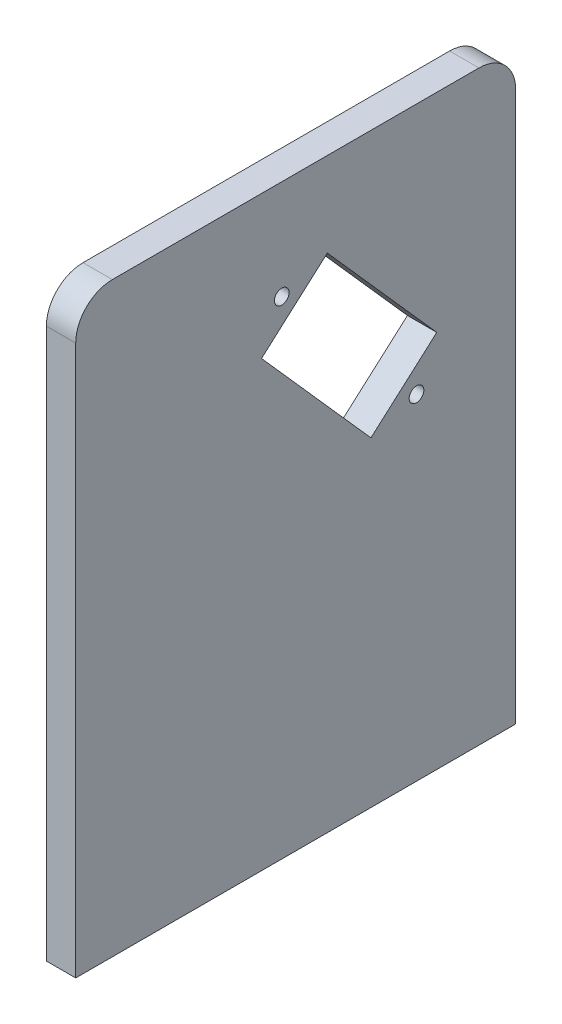
ISO-10303-21;
HEADER;
FILE_DESCRIPTION(('STEP AP214'),'2;1');
FILE_NAME('part.step','',(''),(''),'','','');
FILE_SCHEMA(('AUTOMOTIVE_DESIGN { 1 0 10303 214 1 1 1 1 }'));
ENDSEC;
DATA;
#1=APPLICATION_CONTEXT('core data for automotive mechanical design processes');
#2=APPLICATION_PROTOCOL_DEFINITION('international standard','automotive_design',2000,#1);
#3=PRODUCT_CONTEXT('',#1,'mechanical');
#4=PRODUCT('Part','Part','',(#3));
#5=PRODUCT_RELATED_PRODUCT_CATEGORY('part','',(#4));
#6=PRODUCT_DEFINITION_FORMATION('','',#4);
#7=PRODUCT_DEFINITION_CONTEXT('part definition',#1,'design');
#8=PRODUCT_DEFINITION('design','',#6,#7);
#9=PRODUCT_DEFINITION_SHAPE('','',#8);
#10=(LENGTH_UNIT() NAMED_UNIT(*) SI_UNIT(.MILLI.,.METRE.));
#11=(NAMED_UNIT(*) PLANE_ANGLE_UNIT() SI_UNIT($,.RADIAN.));
#12=(NAMED_UNIT(*) SI_UNIT($,.STERADIAN.) SOLID_ANGLE_UNIT());
#13=UNCERTAINTY_MEASURE_WITH_UNIT(LENGTH_MEASURE(1.E-05),#10,'distance_accuracy_value','');
#14=(GEOMETRIC_REPRESENTATION_CONTEXT(3) GLOBAL_UNCERTAINTY_ASSIGNED_CONTEXT((#13)) GLOBAL_UNIT_ASSIGNED_CONTEXT((#10,
#11,#12)) REPRESENTATION_CONTEXT('',''));
#15=CARTESIAN_POINT('',(0.,0.,0.));
#16=DIRECTION('',(0.,0.,1.));
#17=DIRECTION('',(1.,0.,0.));
#18=AXIS2_PLACEMENT_3D('',#15,#16,#17);
#19=CARTESIAN_POINT('',(0.,3.,-34.2125486187539));
#20=DIRECTION('',(0.,0.,-1.));
#21=DIRECTION('',(-1.,0.,0.));
#22=AXIS2_PLACEMENT_3D('',#19,#20,#21);
#23=PLANE('',#22);
#24=DIRECTION('',(0.,-1.,0.));
#25=VECTOR('',#24,1.);
#26=CARTESIAN_POINT('',(-50.7713050323184,3.,-34.2125486187539));
#27=LINE('',#26,#25);
#28=CARTESIAN_POINT('',(-50.7713050323184,75.,-34.2125486187539));
#29=VERTEX_POINT('',#28);
#30=CARTESIAN_POINT('',(-50.7713050323184,0.,-34.2125486187539));
#31=VERTEX_POINT('',#30);
#32=EDGE_CURVE('E177',#29,#31,#27,.T.);
#33=ORIENTED_EDGE('',*,*,#32,.F.);
#34=DIRECTION('',(1.,0.,0.));
#35=VECTOR('',#34,1.);
#36=CARTESIAN_POINT('',(-46.7713050323184,75.,-34.2125486187539));
#37=LINE('',#36,#35);
#38=CARTESIAN_POINT('',(-46.7713050323184,75.,-34.2125486187539));
#39=VERTEX_POINT('',#38);
#40=EDGE_CURVE('E179',#29,#39,#37,.T.);
#41=ORIENTED_EDGE('',*,*,#40,.T.);
#42=DIRECTION('',(0.,-1.,0.));
#43=VECTOR('',#42,1.);
#44=CARTESIAN_POINT('',(-46.7713050323184,3.,-34.2125486187539));
#45=LINE('',#44,#43);
#46=CARTESIAN_POINT('',(-46.7713050323184,0.,-34.2125486187539));
#47=VERTEX_POINT('',#46);
#48=EDGE_CURVE('E171',#39,#47,#45,.T.);
#49=ORIENTED_EDGE('',*,*,#48,.T.);
#50=DIRECTION('',(1.,0.,0.));
#51=VECTOR('',#50,1.);
#52=CARTESIAN_POINT('',(0.,0.,-34.2125486187539));
#53=LINE('',#52,#51);
#54=EDGE_CURVE('E159',#31,#47,#53,.T.);
#55=ORIENTED_EDGE('',*,*,#54,.F.);
#56=EDGE_LOOP('',(#33,#41,#49,#55));
#57=FACE_BOUND('',#56,.T.);
#58=ADVANCED_FACE('F37',(#57),#23,.T.);
#59=CARTESIAN_POINT('',(-50.7713050323184,3.,0.));
#60=DIRECTION('',(1.,0.,0.));
#61=DIRECTION('',(0.,0.,-1.));
#62=AXIS2_PLACEMENT_3D('',#59,#60,#61);
#63=PLANE('',#62);
#64=CARTESIAN_POINT('',(-50.7713050323184,45.7089563313556,-20.6944099998178));
#65=DIRECTION('',(-1.,0.,0.));
#66=DIRECTION('',(0.,0.,1.));
#67=AXIS2_PLACEMENT_3D('',#64,#65,#66);
#68=CIRCLE('',#67,0.999999999999962);
#69=CARTESIAN_POINT('',(-50.7713050323184,45.7089563313556,-19.6944099998178));
#70=VERTEX_POINT('',#69);
#71=EDGE_CURVE('E276',#70,#70,#68,.T.);
#72=ORIENTED_EDGE('',*,*,#71,.F.);
#73=EDGE_LOOP('',(#72));
#74=FACE_BOUND('',#73,.T.);
#75=CARTESIAN_POINT('',(-50.7713050323184,66.434710761798,-2.31689375607587));
#76=DIRECTION('',(-1.,0.,0.));
#77=DIRECTION('',(0.,0.,1.));
#78=AXIS2_PLACEMENT_3D('',#75,#76,#77);
#79=CIRCLE('',#78,1.00000000000002);
#80=CARTESIAN_POINT('',(-50.7713050323184,66.434710761798,-1.31689375607585));
#81=VERTEX_POINT('',#80);
#82=EDGE_CURVE('E268',#81,#81,#79,.T.);
#83=ORIENTED_EDGE('',*,*,#82,.F.);
#84=EDGE_LOOP('',(#83));
#85=FACE_BOUND('',#84,.T.);
#86=DIRECTION('',(0.,0.748222181604418,0.663448239846279));
#87=VECTOR('',#86,1.);
#88=CARTESIAN_POINT('',(-50.7713050323184,60.5086436505488,0.447473909950315));
#89=LINE('',#88,#87);
#90=CARTESIAN_POINT('',(-50.7713050323184,43.6736445644494,-14.480111486591));
#91=VERTEX_POINT('',#90);
#92=CARTESIAN_POINT('',(-50.7713050323184,60.5086436505488,0.447473909950315));
#93=VERTEX_POINT('',#92);
#94=EDGE_CURVE('E137',#91,#93,#89,.T.);
#95=ORIENTED_EDGE('',*,*,#94,.F.);
#96=DIRECTION('',(0.,-0.663448239846306,0.748222181604394));
#97=VECTOR('',#96,1.);
#98=CARTESIAN_POINT('',(-50.7713050323184,43.6736445644494,-14.480111486591));
#99=LINE('',#98,#97);
#100=CARTESIAN_POINT('',(-50.7713050323184,51.6350234426051,-23.4587776658437));
#101=VERTEX_POINT('',#100);
#102=EDGE_CURVE('E52',#101,#91,#99,.T.);
#103=ORIENTED_EDGE('',*,*,#102,.F.);
#104=DIRECTION('',(0.,-0.748222181604417,-0.663448239846279));
#105=VECTOR('',#104,1.);
#106=CARTESIAN_POINT('',(-50.7713050323184,51.6350234426051,-23.4587776658437));
#107=LINE('',#106,#105);
#108=CARTESIAN_POINT('',(-50.7713050323184,68.4700225287042,-8.53119226930269));
#109=VERTEX_POINT('',#108);
#110=EDGE_CURVE('E124',#109,#101,#107,.T.);
#111=ORIENTED_EDGE('',*,*,#110,.F.);
#112=DIRECTION('',(0.,0.663448239846279,-0.748222181604417));
#113=VECTOR('',#112,1.);
#114=CARTESIAN_POINT('',(-50.7713050323184,68.4700225287042,-8.53119226930269));
#115=LINE('',#114,#113);
#116=EDGE_CURVE('E132',#93,#109,#115,.T.);
#117=ORIENTED_EDGE('',*,*,#116,.F.);
#118=EDGE_LOOP('',(#95,#103,#111,#117));
#119=FACE_BOUND('',#118,.T.);
#120=DIRECTION('',(0.,0.,1.));
#121=VECTOR('',#120,1.);
#122=CARTESIAN_POINT('',(-50.7713050323184,80.,-34.2125486187539));
#123=LINE('',#122,#121);
#124=CARTESIAN_POINT('',(-50.7713050323184,80.,-29.2125486187539));
#125=VERTEX_POINT('',#124);
#126=CARTESIAN_POINT('',(-50.7713050323184,80.,20.7874513812461));
#127=VERTEX_POINT('',#126);
#128=EDGE_CURVE('E156',#125,#127,#123,.T.);
#129=ORIENTED_EDGE('',*,*,#128,.F.);
#130=CARTESIAN_POINT('',(-50.7713050323184,75.,-29.2125486187539));
#131=DIRECTION('',(1.,0.,0.));
#132=DIRECTION('',(0.,0.,-1.));
#133=AXIS2_PLACEMENT_3D('',#130,#131,#132);
#134=CIRCLE('',#133,5.);
#135=EDGE_CURVE('E45',#125,#29,#134,.F.);
#136=ORIENTED_EDGE('',*,*,#135,.T.);
#137=ORIENTED_EDGE('',*,*,#32,.T.);
#138=DIRECTION('',(0.,0.,1.));
#139=VECTOR('',#138,1.);
#140=CARTESIAN_POINT('',(-50.7713050323184,0.,0.));
#141=LINE('',#140,#139);
#142=CARTESIAN_POINT('',(-50.7713050323184,0.,25.7874513812461));
#143=VERTEX_POINT('',#142);
#144=EDGE_CURVE('E162',#31,#143,#141,.T.);
#145=ORIENTED_EDGE('',*,*,#144,.T.);
#146=DIRECTION('',(0.,-1.,0.));
#147=VECTOR('',#146,1.);
#148=CARTESIAN_POINT('',(-50.7713050323184,3.,25.7874513812461));
#149=LINE('',#148,#147);
#150=CARTESIAN_POINT('',(-50.7713050323184,75.,25.7874513812461));
#151=VERTEX_POINT('',#150);
#152=EDGE_CURVE('E175',#151,#143,#149,.T.);
#153=ORIENTED_EDGE('',*,*,#152,.F.);
#154=CARTESIAN_POINT('',(-50.7713050323184,75.,20.7874513812461));
#155=DIRECTION('',(1.,0.,0.));
#156=DIRECTION('',(0.,0.,-1.));
#157=AXIS2_PLACEMENT_3D('',#154,#155,#156);
#158=CIRCLE('',#157,5.);
#159=EDGE_CURVE('E190',#151,#127,#158,.F.);
#160=ORIENTED_EDGE('',*,*,#159,.T.);
#161=EDGE_LOOP('',(#129,#136,#137,#145,#153,#160));
#162=FACE_BOUND('',#161,.T.);
#163=ADVANCED_FACE('F135',(#74,#85,#119,#162),#63,.F.);
#164=CARTESIAN_POINT('',(0.,3.,25.7874513812461));
#165=DIRECTION('',(0.,0.,1.));
#166=DIRECTION('',(1.,0.,0.));
#167=AXIS2_PLACEMENT_3D('',#164,#165,#166);
#168=PLANE('',#167);
#169=DIRECTION('',(0.,-1.,0.));
#170=VECTOR('',#169,1.);
#171=CARTESIAN_POINT('',(-46.7713050323184,3.,25.7874513812461));
#172=LINE('',#171,#170);
#173=CARTESIAN_POINT('',(-46.7713050323184,75.,25.7874513812461));
#174=VERTEX_POINT('',#173);
#175=CARTESIAN_POINT('',(-46.7713050323184,0.,25.7874513812461));
#176=VERTEX_POINT('',#175);
#177=EDGE_CURVE('E173',#174,#176,#172,.T.);
#178=ORIENTED_EDGE('',*,*,#177,.F.);
#179=DIRECTION('',(-1.,0.,0.));
#180=VECTOR('',#179,1.);
#181=CARTESIAN_POINT('',(-50.7713050323184,75.,25.7874513812461));
#182=LINE('',#181,#180);
#183=EDGE_CURVE('E11',#174,#151,#182,.T.);
#184=ORIENTED_EDGE('',*,*,#183,.T.);
#185=ORIENTED_EDGE('',*,*,#152,.T.);
#186=DIRECTION('',(-1.,0.,0.));
#187=VECTOR('',#186,1.);
#188=CARTESIAN_POINT('',(0.,0.,25.7874513812461));
#189=LINE('',#188,#187);
#190=EDGE_CURVE('E165',#176,#143,#189,.T.);
#191=ORIENTED_EDGE('',*,*,#190,.F.);
#192=EDGE_LOOP('',(#178,#184,#185,#191));
#193=FACE_BOUND('',#192,.T.);
#194=ADVANCED_FACE('F215',(#193),#168,.T.);
#195=CARTESIAN_POINT('',(-46.7713050323184,3.,0.));
#196=DIRECTION('',(1.,0.,0.));
#197=DIRECTION('',(0.,0.,-1.));
#198=AXIS2_PLACEMENT_3D('',#195,#196,#197);
#199=PLANE('',#198);
#200=CARTESIAN_POINT('',(-46.7713050323184,45.7089563313556,-20.6944099998178));
#201=DIRECTION('',(1.,0.,0.));
#202=DIRECTION('',(0.,0.,-1.));
#203=AXIS2_PLACEMENT_3D('',#200,#201,#202);
#204=CIRCLE('',#203,0.999999999999962);
#205=CARTESIAN_POINT('',(-46.7713050323184,45.7089563313556,-21.6944099998178));
#206=VERTEX_POINT('',#205);
#207=EDGE_CURVE('E273',#206,#206,#204,.F.);
#208=ORIENTED_EDGE('',*,*,#207,.T.);
#209=EDGE_LOOP('',(#208));
#210=FACE_BOUND('',#209,.T.);
#211=CARTESIAN_POINT('',(-46.7713050323184,66.434710761798,-2.31689375607587));
#212=DIRECTION('',(1.,0.,0.));
#213=DIRECTION('',(0.,0.,-1.));
#214=AXIS2_PLACEMENT_3D('',#211,#212,#213);
#215=CIRCLE('',#214,1.00000000000002);
#216=CARTESIAN_POINT('',(-46.7713050323184,66.434710761798,-3.31689375607589));
#217=VERTEX_POINT('',#216);
#218=EDGE_CURVE('E148',#217,#217,#215,.F.);
#219=ORIENTED_EDGE('',*,*,#218,.T.);
#220=EDGE_LOOP('',(#219));
#221=FACE_BOUND('',#220,.T.);
#222=DIRECTION('',(0.,-0.663448239846306,0.748222181604394));
#223=VECTOR('',#222,1.);
#224=CARTESIAN_POINT('',(-46.7713050323184,43.6736445644494,-14.480111486591));
#225=LINE('',#224,#223);
#226=CARTESIAN_POINT('',(-46.7713050323184,51.6350234426051,-23.4587776658437));
#227=VERTEX_POINT('',#226);
#228=CARTESIAN_POINT('',(-46.7713050323184,43.6736445644494,-14.480111486591));
#229=VERTEX_POINT('',#228);
#230=EDGE_CURVE('E117',#227,#229,#225,.T.);
#231=ORIENTED_EDGE('',*,*,#230,.T.);
#232=DIRECTION('',(0.,0.748222181604418,0.663448239846279));
#233=VECTOR('',#232,1.);
#234=CARTESIAN_POINT('',(-46.7713050323184,60.5086436505488,0.447473909950316));
#235=LINE('',#234,#233);
#236=CARTESIAN_POINT('',(-46.7713050323184,60.5086436505488,0.44747390995031));
#237=VERTEX_POINT('',#236);
#238=EDGE_CURVE('E140',#229,#237,#235,.T.);
#239=ORIENTED_EDGE('',*,*,#238,.T.);
#240=DIRECTION('',(0.,0.66344823984628,-0.748222181604417));
#241=VECTOR('',#240,1.);
#242=CARTESIAN_POINT('',(-46.7713050323184,68.4700225287042,-8.53119226930269));
#243=LINE('',#242,#241);
#244=CARTESIAN_POINT('',(-46.7713050323184,68.4700225287042,-8.53119226930269));
#245=VERTEX_POINT('',#244);
#246=EDGE_CURVE('E120',#237,#245,#243,.T.);
#247=ORIENTED_EDGE('',*,*,#246,.T.);
#248=DIRECTION('',(0.,-0.748222181604417,-0.663448239846279));
#249=VECTOR('',#248,1.);
#250=CARTESIAN_POINT('',(-46.7713050323184,51.6350234426051,-23.4587776658437));
#251=LINE('',#250,#249);
#252=EDGE_CURVE('E121',#245,#227,#251,.T.);
#253=ORIENTED_EDGE('',*,*,#252,.T.);
#254=EDGE_LOOP('',(#231,#239,#247,#253));
#255=FACE_BOUND('',#254,.T.);
#256=ORIENTED_EDGE('',*,*,#48,.F.);
#257=CARTESIAN_POINT('',(-46.7713050323184,75.,-29.2125486187539));
#258=DIRECTION('',(1.,0.,0.));
#259=DIRECTION('',(0.,0.,-1.));
#260=AXIS2_PLACEMENT_3D('',#257,#258,#259);
#261=CIRCLE('',#260,5.);
#262=CARTESIAN_POINT('',(-46.7713050323184,80.,-29.2125486187539));
#263=VERTEX_POINT('',#262);
#264=EDGE_CURVE('E184',#39,#263,#261,.T.);
#265=ORIENTED_EDGE('',*,*,#264,.T.);
#266=DIRECTION('',(0.,0.,1.));
#267=VECTOR('',#266,1.);
#268=CARTESIAN_POINT('',(-46.7713050323184,80.,-34.2125486187539));
#269=LINE('',#268,#267);
#270=CARTESIAN_POINT('',(-46.7713050323184,80.,20.7874513812461));
#271=VERTEX_POINT('',#270);
#272=EDGE_CURVE('E131',#263,#271,#269,.T.);
#273=ORIENTED_EDGE('',*,*,#272,.T.);
#274=CARTESIAN_POINT('',(-46.7713050323184,75.,20.7874513812461));
#275=DIRECTION('',(1.,0.,0.));
#276=DIRECTION('',(0.,0.,-1.));
#277=AXIS2_PLACEMENT_3D('',#274,#275,#276);
#278=CIRCLE('',#277,5.);
#279=EDGE_CURVE('E182',#271,#174,#278,.T.);
#280=ORIENTED_EDGE('',*,*,#279,.T.);
#281=ORIENTED_EDGE('',*,*,#177,.T.);
#282=DIRECTION('',(0.,0.,1.));
#283=VECTOR('',#282,1.);
#284=CARTESIAN_POINT('',(-46.7713050323184,0.,0.));
#285=LINE('',#284,#283);
#286=EDGE_CURVE('E168',#47,#176,#285,.T.);
#287=ORIENTED_EDGE('',*,*,#286,.F.);
#288=EDGE_LOOP('',(#256,#265,#273,#280,#281,#287));
#289=FACE_BOUND('',#288,.T.);
#290=ADVANCED_FACE('F204',(#210,#221,#255,#289),#199,.T.);
#291=CARTESIAN_POINT('',(0.,0.,0.));
#292=DIRECTION('',(0.,1.,0.));
#293=DIRECTION('',(0.,0.,1.));
#294=AXIS2_PLACEMENT_3D('',#291,#292,#293);
#295=PLANE('',#294);
#296=ORIENTED_EDGE('',*,*,#54,.T.);
#297=ORIENTED_EDGE('',*,*,#286,.T.);
#298=ORIENTED_EDGE('',*,*,#190,.T.);
#299=ORIENTED_EDGE('',*,*,#144,.F.);
#300=EDGE_LOOP('',(#296,#297,#298,#299));
#301=FACE_BOUND('',#300,.T.);
#302=ADVANCED_FACE('F218',(#301),#295,.F.);
#303=CARTESIAN_POINT('',(0.,80.,0.));
#304=DIRECTION('',(0.,-1.,0.));
#305=DIRECTION('',(0.,0.,-1.));
#306=AXIS2_PLACEMENT_3D('',#303,#304,#305);
#307=PLANE('',#306);
#308=ORIENTED_EDGE('',*,*,#272,.F.);
#309=DIRECTION('',(1.,0.,0.));
#310=VECTOR('',#309,1.);
#311=CARTESIAN_POINT('',(-50.7713050323183,80.,-29.2125486187539));
#312=LINE('',#311,#310);
#313=EDGE_CURVE('E188',#263,#125,#312,.F.);
#314=ORIENTED_EDGE('',*,*,#313,.T.);
#315=ORIENTED_EDGE('',*,*,#128,.T.);
#316=DIRECTION('',(-1.,0.,0.));
#317=VECTOR('',#316,1.);
#318=CARTESIAN_POINT('',(-46.7713050323184,80.,20.7874513812461));
#319=LINE('',#318,#317);
#320=EDGE_CURVE('E186',#127,#271,#319,.F.);
#321=ORIENTED_EDGE('',*,*,#320,.T.);
#322=EDGE_LOOP('',(#308,#314,#315,#321));
#323=FACE_BOUND('',#322,.T.);
#324=ADVANCED_FACE('F208',(#323),#307,.F.);
#325=CARTESIAN_POINT('',(0.,75.,-29.2125486187539));
#326=DIRECTION('',(-1.,0.,0.));
#327=DIRECTION('',(0.,0.,1.));
#328=AXIS2_PLACEMENT_3D('',#325,#326,#327);
#329=CYLINDRICAL_SURFACE('',#328,5.);
#330=ORIENTED_EDGE('',*,*,#135,.F.);
#331=ORIENTED_EDGE('',*,*,#313,.F.);
#332=ORIENTED_EDGE('',*,*,#264,.F.);
#333=ORIENTED_EDGE('',*,*,#40,.F.);
#334=EDGE_LOOP('',(#330,#331,#332,#333));
#335=FACE_BOUND('',#334,.T.);
#336=ADVANCED_FACE('F201',(#335),#329,.T.);
#337=CARTESIAN_POINT('',(0.,75.,20.7874513812461));
#338=DIRECTION('',(1.,0.,0.));
#339=DIRECTION('',(0.,0.,-1.));
#340=AXIS2_PLACEMENT_3D('',#337,#338,#339);
#341=CYLINDRICAL_SURFACE('',#340,5.);
#342=ORIENTED_EDGE('',*,*,#279,.F.);
#343=ORIENTED_EDGE('',*,*,#320,.F.);
#344=ORIENTED_EDGE('',*,*,#159,.F.);
#345=ORIENTED_EDGE('',*,*,#183,.F.);
#346=EDGE_LOOP('',(#342,#343,#344,#345));
#347=FACE_BOUND('',#346,.T.);
#348=ADVANCED_FACE('F39',(#347),#341,.T.);
#349=CARTESIAN_POINT('',(-12.3275940744187,43.6736445644494,-14.480111486591));
#350=DIRECTION('',(0.,-0.748222181604394,-0.663448239846306));
#351=DIRECTION('',(0.,0.663448239846306,-0.748222181604394));
#352=AXIS2_PLACEMENT_3D('',#349,#350,#351);
#353=PLANE('',#352);
#354=DIRECTION('',(-1.,0.,0.));
#355=VECTOR('',#354,1.);
#356=CARTESIAN_POINT('',(-12.3275940744187,51.6350234426051,-23.4587776658437));
#357=LINE('',#356,#355);
#358=EDGE_CURVE('E113',#227,#101,#357,.T.);
#359=ORIENTED_EDGE('',*,*,#358,.T.);
#360=ORIENTED_EDGE('',*,*,#102,.T.);
#361=DIRECTION('',(-1.,0.,0.));
#362=VECTOR('',#361,1.);
#363=CARTESIAN_POINT('',(-12.3275940744187,43.6736445644494,-14.480111486591));
#364=LINE('',#363,#362);
#365=EDGE_CURVE('E147',#229,#91,#364,.T.);
#366=ORIENTED_EDGE('',*,*,#365,.F.);
#367=ORIENTED_EDGE('',*,*,#230,.F.);
#368=EDGE_LOOP('',(#359,#360,#366,#367));
#369=FACE_BOUND('',#368,.T.);
#370=ADVANCED_FACE('F115',(#369),#353,.F.);
#371=CARTESIAN_POINT('',(-12.3275940744187,51.6350234426051,-23.4587776658437));
#372=DIRECTION('',(0.,0.663448239846279,-0.748222181604417));
#373=DIRECTION('',(0.,0.748222181604417,0.663448239846279));
#374=AXIS2_PLACEMENT_3D('',#371,#372,#373);
#375=PLANE('',#374);
#376=DIRECTION('',(-1.,0.,0.));
#377=VECTOR('',#376,1.);
#378=CARTESIAN_POINT('',(-12.3275940744187,68.4700225287042,-8.53119226930269));
#379=LINE('',#378,#377);
#380=EDGE_CURVE('E127',#245,#109,#379,.T.);
#381=ORIENTED_EDGE('',*,*,#380,.T.);
#382=ORIENTED_EDGE('',*,*,#110,.T.);
#383=ORIENTED_EDGE('',*,*,#358,.F.);
#384=ORIENTED_EDGE('',*,*,#252,.F.);
#385=EDGE_LOOP('',(#381,#382,#383,#384));
#386=FACE_BOUND('',#385,.T.);
#387=ADVANCED_FACE('F125',(#386),#375,.F.);
#388=CARTESIAN_POINT('',(-12.3275940744187,68.4700225287042,-8.53119226930269));
#389=DIRECTION('',(0.,0.748222181604417,0.663448239846279));
#390=DIRECTION('',(0.,-0.66344823984628,0.748222181604417));
#391=AXIS2_PLACEMENT_3D('',#388,#389,#390);
#392=PLANE('',#391);
#393=DIRECTION('',(-1.,0.,0.));
#394=VECTOR('',#393,1.);
#395=CARTESIAN_POINT('',(-12.3275940744187,60.5086436505488,0.447473909950315));
#396=LINE('',#395,#394);
#397=EDGE_CURVE('E60',#237,#93,#396,.T.);
#398=ORIENTED_EDGE('',*,*,#397,.T.);
#399=ORIENTED_EDGE('',*,*,#116,.T.);
#400=ORIENTED_EDGE('',*,*,#380,.F.);
#401=ORIENTED_EDGE('',*,*,#246,.F.);
#402=EDGE_LOOP('',(#398,#399,#400,#401));
#403=FACE_BOUND('',#402,.T.);
#404=ADVANCED_FACE('F247',(#403),#392,.F.);
#405=CARTESIAN_POINT('',(-12.3275940744187,60.5086436505488,0.447473909950315));
#406=DIRECTION('',(0.,-0.663448239846279,0.748222181604418));
#407=DIRECTION('',(0.,-0.748222181604418,-0.663448239846279));
#408=AXIS2_PLACEMENT_3D('',#405,#406,#407);
#409=PLANE('',#408);
#410=ORIENTED_EDGE('',*,*,#365,.T.);
#411=ORIENTED_EDGE('',*,*,#94,.T.);
#412=ORIENTED_EDGE('',*,*,#397,.F.);
#413=ORIENTED_EDGE('',*,*,#238,.F.);
#414=EDGE_LOOP('',(#410,#411,#412,#413));
#415=FACE_BOUND('',#414,.T.);
#416=ADVANCED_FACE('F252',(#415),#409,.F.);
#417=CARTESIAN_POINT('',(-12.3275940744187,66.434710761798,-2.31689375607587));
#418=DIRECTION('',(-1.,0.,0.));
#419=DIRECTION('',(0.,0.,1.));
#420=AXIS2_PLACEMENT_3D('',#417,#418,#419);
#421=CYLINDRICAL_SURFACE('',#420,1.00000000000002);
#422=ORIENTED_EDGE('',*,*,#82,.T.);
#423=EDGE_LOOP('',(#422));
#424=FACE_BOUND('',#423,.T.);
#425=ORIENTED_EDGE('',*,*,#218,.F.);
#426=EDGE_LOOP('',(#425));
#427=FACE_BOUND('',#426,.T.);
#428=ADVANCED_FACE('F256',(#424,#427),#421,.F.);
#429=CARTESIAN_POINT('',(-12.3275940744187,45.7089563313556,-20.6944099998178));
#430=DIRECTION('',(-1.,0.,0.));
#431=DIRECTION('',(0.,0.,1.));
#432=AXIS2_PLACEMENT_3D('',#429,#430,#431);
#433=CYLINDRICAL_SURFACE('',#432,0.999999999999962);
#434=ORIENTED_EDGE('',*,*,#71,.T.);
#435=EDGE_LOOP('',(#434));
#436=FACE_BOUND('',#435,.T.);
#437=ORIENTED_EDGE('',*,*,#207,.F.);
#438=EDGE_LOOP('',(#437));
#439=FACE_BOUND('',#438,.T.);
#440=ADVANCED_FACE('F257',(#436,#439),#433,.F.);
#441=CLOSED_SHELL('',(#58,#163,#194,#290,#302,#324,#336,#348,#370,#387,#404,#416,#428,#440));
#442=MANIFOLD_SOLID_BREP('B2',#441);
#443=ADVANCED_BREP_SHAPE_REPRESENTATION('',(#18,#442),#14);
#444=SHAPE_DEFINITION_REPRESENTATION(#9,#443);
ENDSEC;
END-ISO-10303-21;
